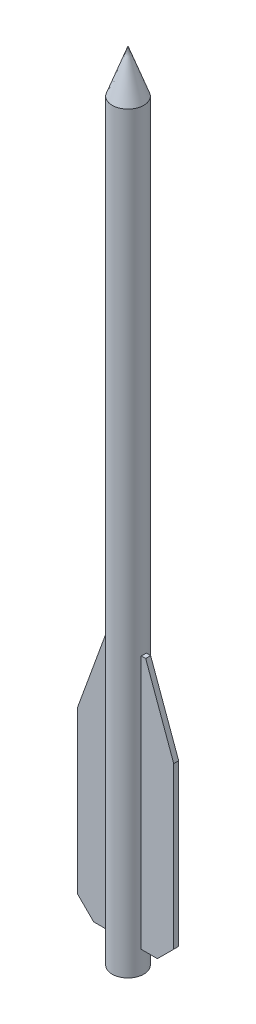
ISO-10303-21;
HEADER;
FILE_DESCRIPTION(('STEP AP214'),'2;1');
FILE_NAME('part.step','',(''),(''),'','','');
FILE_SCHEMA(('AUTOMOTIVE_DESIGN { 1 0 10303 214 1 1 1 1 }'));
ENDSEC;
DATA;
#1=APPLICATION_CONTEXT('core data for automotive mechanical design processes');
#2=APPLICATION_PROTOCOL_DEFINITION('international standard','automotive_design',2000,#1);
#3=PRODUCT_CONTEXT('',#1,'mechanical');
#4=PRODUCT('Part','Part','',(#3));
#5=PRODUCT_RELATED_PRODUCT_CATEGORY('part','',(#4));
#6=PRODUCT_DEFINITION_FORMATION('','',#4);
#7=PRODUCT_DEFINITION_CONTEXT('part definition',#1,'design');
#8=PRODUCT_DEFINITION('design','',#6,#7);
#9=PRODUCT_DEFINITION_SHAPE('','',#8);
#10=(LENGTH_UNIT() NAMED_UNIT(*) SI_UNIT(.MILLI.,.METRE.));
#11=(NAMED_UNIT(*) PLANE_ANGLE_UNIT() SI_UNIT($,.RADIAN.));
#12=(NAMED_UNIT(*) SI_UNIT($,.STERADIAN.) SOLID_ANGLE_UNIT());
#13=UNCERTAINTY_MEASURE_WITH_UNIT(LENGTH_MEASURE(1.E-05),#10,'distance_accuracy_value','');
#14=(GEOMETRIC_REPRESENTATION_CONTEXT(3) GLOBAL_UNCERTAINTY_ASSIGNED_CONTEXT((#13)) GLOBAL_UNIT_ASSIGNED_CONTEXT((#10,
#11,#12)) REPRESENTATION_CONTEXT('',''));
#15=CARTESIAN_POINT('',(0.,0.,0.));
#16=DIRECTION('',(0.,0.,1.));
#17=DIRECTION('',(1.,0.,0.));
#18=AXIS2_PLACEMENT_3D('',#15,#16,#17);
#19=CARTESIAN_POINT('',(0.,161.,0.));
#20=DIRECTION('',(0.,-1.,0.));
#21=DIRECTION('',(0.,0.,-1.));
#22=AXIS2_PLACEMENT_3D('',#19,#20,#21);
#23=CYLINDRICAL_SURFACE('',#22,3.2);
#24=DIRECTION('',(0.,-1.,0.));
#25=VECTOR('',#24,1.);
#26=CARTESIAN_POINT('',(-3.16069612585582,161.,0.5));
#27=LINE('',#26,#25);
#28=CARTESIAN_POINT('',(-3.16069612585582,4.6,0.5));
#29=VERTEX_POINT('',#28);
#30=CARTESIAN_POINT('',(-3.16069612585582,56.,0.5));
#31=VERTEX_POINT('',#30);
#32=EDGE_CURVE('E222',#29,#31,#27,.F.);
#33=ORIENTED_EDGE('',*,*,#32,.F.);
#34=CARTESIAN_POINT('',(0.,4.59999999999999,0.));
#35=DIRECTION('',(0.,1.,0.));
#36=DIRECTION('',(-1.,0.,0.));
#37=AXIS2_PLACEMENT_3D('',#34,#35,#36);
#38=CIRCLE('',#37,3.2);
#39=CARTESIAN_POINT('',(-3.16069612585582,4.6,-0.5));
#40=VERTEX_POINT('',#39);
#41=EDGE_CURVE('E218',#40,#29,#38,.T.);
#42=ORIENTED_EDGE('',*,*,#41,.F.);
#43=DIRECTION('',(0.,-1.,0.));
#44=VECTOR('',#43,1.);
#45=CARTESIAN_POINT('',(-3.16069612585582,161.,-0.5));
#46=LINE('',#45,#44);
#47=CARTESIAN_POINT('',(-3.16069612585582,56.,-0.5));
#48=VERTEX_POINT('',#47);
#49=EDGE_CURVE('E215',#40,#48,#46,.F.);
#50=ORIENTED_EDGE('',*,*,#49,.T.);
#51=CARTESIAN_POINT('',(0.,56.,0.));
#52=DIRECTION('',(0.,-1.,0.));
#53=DIRECTION('',(0.,0.,-1.));
#54=AXIS2_PLACEMENT_3D('',#51,#52,#53);
#55=CIRCLE('',#54,3.2);
#56=EDGE_CURVE('E220',#31,#48,#55,.T.);
#57=ORIENTED_EDGE('',*,*,#56,.F.);
#58=EDGE_LOOP('',(#33,#42,#50,#57));
#59=FACE_BOUND('',#58,.T.);
#60=CARTESIAN_POINT('',(0.,152.208072257745,0.));
#61=DIRECTION('',(0.,1.,0.));
#62=DIRECTION('',(0.,0.,1.));
#63=AXIS2_PLACEMENT_3D('',#60,#61,#62);
#64=CIRCLE('',#63,3.2);
#65=CARTESIAN_POINT('',(0.,152.208072257745,3.2));
#66=VERTEX_POINT('',#65);
#67=EDGE_CURVE('E212',#66,#66,#64,.F.);
#68=ORIENTED_EDGE('',*,*,#67,.T.);
#69=EDGE_LOOP('',(#68));
#70=FACE_BOUND('',#69,.T.);
#71=CARTESIAN_POINT('',(0.,0.,0.));
#72=DIRECTION('',(0.,1.,0.));
#73=DIRECTION('',(0.,0.,1.));
#74=AXIS2_PLACEMENT_3D('',#71,#72,#73);
#75=CIRCLE('',#74,3.2);
#76=CARTESIAN_POINT('',(0.,0.,3.2));
#77=VERTEX_POINT('',#76);
#78=EDGE_CURVE('E209',#77,#77,#75,.T.);
#79=ORIENTED_EDGE('',*,*,#78,.T.);
#80=EDGE_LOOP('',(#79));
#81=FACE_BOUND('',#80,.T.);
#82=DIRECTION('',(0.,-1.,0.));
#83=VECTOR('',#82,1.);
#84=CARTESIAN_POINT('',(3.16069612585582,161.,0.5));
#85=LINE('',#84,#83);
#86=CARTESIAN_POINT('',(3.16069612585582,56.,0.5));
#87=VERTEX_POINT('',#86);
#88=CARTESIAN_POINT('',(3.16069612585582,4.6,0.5));
#89=VERTEX_POINT('',#88);
#90=EDGE_CURVE('E11',#87,#89,#85,.T.);
#91=ORIENTED_EDGE('',*,*,#90,.F.);
#92=CARTESIAN_POINT('',(0.,56.,0.));
#93=DIRECTION('',(0.,1.,0.));
#94=DIRECTION('',(0.,0.,1.));
#95=AXIS2_PLACEMENT_3D('',#92,#93,#94);
#96=CIRCLE('',#95,3.2);
#97=CARTESIAN_POINT('',(3.16069612585582,56.,-0.5));
#98=VERTEX_POINT('',#97);
#99=EDGE_CURVE('E227',#87,#98,#96,.T.);
#100=ORIENTED_EDGE('',*,*,#99,.T.);
#101=DIRECTION('',(0.,-1.,0.));
#102=VECTOR('',#101,1.);
#103=CARTESIAN_POINT('',(3.16069612585582,161.,-0.5));
#104=LINE('',#103,#102);
#105=CARTESIAN_POINT('',(3.16069612585582,4.59999999999999,-0.5));
#106=VERTEX_POINT('',#105);
#107=EDGE_CURVE('E224',#98,#106,#104,.T.);
#108=ORIENTED_EDGE('',*,*,#107,.T.);
#109=CARTESIAN_POINT('',(0.,4.59999999999999,0.));
#110=DIRECTION('',(0.,-1.,0.));
#111=DIRECTION('',(1.,0.,0.));
#112=AXIS2_PLACEMENT_3D('',#109,#110,#111);
#113=CIRCLE('',#112,3.2);
#114=EDGE_CURVE('E47',#106,#89,#113,.T.);
#115=ORIENTED_EDGE('',*,*,#114,.T.);
#116=EDGE_LOOP('',(#91,#100,#108,#115));
#117=FACE_BOUND('',#116,.T.);
#118=ADVANCED_FACE('F38',(#59,#70,#81,#117),#23,.T.);
#119=CARTESIAN_POINT('',(0.,0.,0.));
#120=DIRECTION('',(0.,1.,0.));
#121=DIRECTION('',(0.,0.,1.));
#122=AXIS2_PLACEMENT_3D('',#119,#120,#121);
#123=PLANE('',#122);
#124=ORIENTED_EDGE('',*,*,#78,.F.);
#125=EDGE_LOOP('',(#124));
#126=FACE_BOUND('',#125,.T.);
#127=ADVANCED_FACE('F251',(#126),#123,.F.);
#128=CARTESIAN_POINT('',(0.,152.208072257745,0.));
#129=DIRECTION('',(0.,-1.,0.));
#130=DIRECTION('',(0.,0.,-1.));
#131=AXIS2_PLACEMENT_3D('',#128,#129,#130);
#132=CONICAL_SURFACE('',#131,3.19999999999997,0.349065850398862);
#133=ORIENTED_EDGE('',*,*,#67,.F.);
#134=EDGE_LOOP('',(#133));
#135=FACE_BOUND('',#134,.T.);
#136=CARTESIAN_POINT('',(0.,161.,0.));
#137=VERTEX_POINT('',#136);
#138=VERTEX_LOOP('',#137);
#139=FACE_BOUND('',#138,.T.);
#140=ADVANCED_FACE('F41',(#135,#139),#132,.T.);
#141=CARTESIAN_POINT('',(0.,0.,0.5));
#142=DIRECTION('',(0.,0.,-1.));
#143=DIRECTION('',(-1.,0.,0.));
#144=AXIS2_PLACEMENT_3D('',#141,#142,#143);
#145=PLANE('',#144);
#146=DIRECTION('',(1.,0.,0.));
#147=VECTOR('',#146,1.);
#148=CARTESIAN_POINT('',(0.,4.6,0.5));
#149=LINE('',#148,#147);
#150=CARTESIAN_POINT('',(-6.45,4.6,0.5));
#151=VERTEX_POINT('',#150);
#152=EDGE_CURVE('E185',#151,#29,#149,.T.);
#153=ORIENTED_EDGE('',*,*,#152,.T.);
#154=ORIENTED_EDGE('',*,*,#32,.T.);
#155=DIRECTION('',(-1.,0.,0.));
#156=VECTOR('',#155,1.);
#157=CARTESIAN_POINT('',(-4.08118555115109,56.,0.5));
#158=LINE('',#157,#156);
#159=CARTESIAN_POINT('',(-4.08118555115109,56.,0.5));
#160=VERTEX_POINT('',#159);
#161=EDGE_CURVE('E176',#31,#160,#158,.T.);
#162=ORIENTED_EDGE('',*,*,#161,.T.);
#163=DIRECTION('',(-0.342020143325663,-0.939692620785911,0.));
#164=VECTOR('',#163,1.);
#165=CARTESIAN_POINT('',(-9.75,40.4250603067092,0.5));
#166=LINE('',#165,#164);
#167=CARTESIAN_POINT('',(-9.75,40.4250603067092,0.5));
#168=VERTEX_POINT('',#167);
#169=EDGE_CURVE('E178',#160,#168,#166,.T.);
#170=ORIENTED_EDGE('',*,*,#169,.T.);
#171=DIRECTION('',(0.,-1.,0.));
#172=VECTOR('',#171,1.);
#173=CARTESIAN_POINT('',(-9.75,7.90000000000001,0.5));
#174=LINE('',#173,#172);
#175=CARTESIAN_POINT('',(-9.75,7.90000000000001,0.5));
#176=VERTEX_POINT('',#175);
#177=EDGE_CURVE('E181',#168,#176,#174,.T.);
#178=ORIENTED_EDGE('',*,*,#177,.T.);
#179=DIRECTION('',(0.707106781186546,-0.707106781186549,0.));
#180=VECTOR('',#179,1.);
#181=CARTESIAN_POINT('',(-6.45,4.6,0.5));
#182=LINE('',#181,#180);
#183=EDGE_CURVE('E183',#176,#151,#182,.T.);
#184=ORIENTED_EDGE('',*,*,#183,.T.);
#185=EDGE_LOOP('',(#153,#154,#162,#170,#178,#184));
#186=FACE_BOUND('',#185,.T.);
#187=ADVANCED_FACE('F284',(#186),#145,.F.);
#188=CARTESIAN_POINT('',(0.,0.,-0.5));
#189=DIRECTION('',(0.,0.,-1.));
#190=DIRECTION('',(-1.,0.,0.));
#191=AXIS2_PLACEMENT_3D('',#188,#189,#190);
#192=PLANE('',#191);
#193=ORIENTED_EDGE('',*,*,#49,.F.);
#194=DIRECTION('',(1.,0.,0.));
#195=VECTOR('',#194,1.);
#196=CARTESIAN_POINT('',(0.,4.6,-0.5));
#197=LINE('',#196,#195);
#198=CARTESIAN_POINT('',(-6.45,4.6,-0.5));
#199=VERTEX_POINT('',#198);
#200=EDGE_CURVE('E179',#199,#40,#197,.T.);
#201=ORIENTED_EDGE('',*,*,#200,.F.);
#202=DIRECTION('',(0.707106781186546,-0.707106781186549,0.));
#203=VECTOR('',#202,1.);
#204=CARTESIAN_POINT('',(-6.45,4.6,-0.5));
#205=LINE('',#204,#203);
#206=CARTESIAN_POINT('',(-9.75,7.90000000000001,-0.5));
#207=VERTEX_POINT('',#206);
#208=EDGE_CURVE('E194',#207,#199,#205,.T.);
#209=ORIENTED_EDGE('',*,*,#208,.F.);
#210=DIRECTION('',(0.,-1.,0.));
#211=VECTOR('',#210,1.);
#212=CARTESIAN_POINT('',(-9.75,7.90000000000001,-0.5));
#213=LINE('',#212,#211);
#214=CARTESIAN_POINT('',(-9.75,40.4250603067092,-0.5));
#215=VERTEX_POINT('',#214);
#216=EDGE_CURVE('E192',#215,#207,#213,.T.);
#217=ORIENTED_EDGE('',*,*,#216,.F.);
#218=DIRECTION('',(-0.342020143325663,-0.939692620785911,0.));
#219=VECTOR('',#218,1.);
#220=CARTESIAN_POINT('',(-9.75,40.4250603067092,-0.5));
#221=LINE('',#220,#219);
#222=CARTESIAN_POINT('',(-4.08118555115109,56.,-0.5));
#223=VERTEX_POINT('',#222);
#224=EDGE_CURVE('E190',#223,#215,#221,.T.);
#225=ORIENTED_EDGE('',*,*,#224,.F.);
#226=DIRECTION('',(-1.,0.,0.));
#227=VECTOR('',#226,1.);
#228=CARTESIAN_POINT('',(-4.08118555115109,56.,-0.5));
#229=LINE('',#228,#227);
#230=EDGE_CURVE('E62',#48,#223,#229,.T.);
#231=ORIENTED_EDGE('',*,*,#230,.F.);
#232=EDGE_LOOP('',(#193,#201,#209,#217,#225,#231));
#233=FACE_BOUND('',#232,.T.);
#234=ADVANCED_FACE('F265',(#233),#192,.T.);
#235=CARTESIAN_POINT('',(-4.08118555115109,56.,0.5));
#236=DIRECTION('',(0.,-1.,0.));
#237=DIRECTION('',(0.,0.,-1.));
#238=AXIS2_PLACEMENT_3D('',#235,#236,#237);
#239=PLANE('',#238);
#240=ORIENTED_EDGE('',*,*,#161,.F.);
#241=ORIENTED_EDGE('',*,*,#56,.T.);
#242=ORIENTED_EDGE('',*,*,#230,.T.);
#243=DIRECTION('',(0.,0.,-1.));
#244=VECTOR('',#243,1.);
#245=CARTESIAN_POINT('',(-4.08118555115109,56.,0.5));
#246=LINE('',#245,#244);
#247=EDGE_CURVE('E206',#160,#223,#246,.T.);
#248=ORIENTED_EDGE('',*,*,#247,.F.);
#249=EDGE_LOOP('',(#240,#241,#242,#248));
#250=FACE_BOUND('',#249,.T.);
#251=ADVANCED_FACE('F261',(#250),#239,.F.);
#252=CARTESIAN_POINT('',(-9.75,40.4250603067092,0.5));
#253=DIRECTION('',(0.939692620785911,-0.342020143325663,0.));
#254=DIRECTION('',(0.342020143325663,0.939692620785911,0.));
#255=AXIS2_PLACEMENT_3D('',#252,#253,#254);
#256=PLANE('',#255);
#257=ORIENTED_EDGE('',*,*,#224,.T.);
#258=DIRECTION('',(0.,0.,-1.));
#259=VECTOR('',#258,1.);
#260=CARTESIAN_POINT('',(-9.75,40.4250603067092,0.5));
#261=LINE('',#260,#259);
#262=EDGE_CURVE('E203',#168,#215,#261,.T.);
#263=ORIENTED_EDGE('',*,*,#262,.F.);
#264=ORIENTED_EDGE('',*,*,#169,.F.);
#265=ORIENTED_EDGE('',*,*,#247,.T.);
#266=EDGE_LOOP('',(#257,#263,#264,#265));
#267=FACE_BOUND('',#266,.T.);
#268=ADVANCED_FACE('F264',(#267),#256,.F.);
#269=CARTESIAN_POINT('',(-9.75,7.90000000000001,0.5));
#270=DIRECTION('',(1.,0.,0.));
#271=DIRECTION('',(0.,0.,-1.));
#272=AXIS2_PLACEMENT_3D('',#269,#270,#271);
#273=PLANE('',#272);
#274=ORIENTED_EDGE('',*,*,#216,.T.);
#275=DIRECTION('',(0.,0.,-1.));
#276=VECTOR('',#275,1.);
#277=CARTESIAN_POINT('',(-9.75,7.90000000000001,0.5));
#278=LINE('',#277,#276);
#279=EDGE_CURVE('E200',#176,#207,#278,.T.);
#280=ORIENTED_EDGE('',*,*,#279,.F.);
#281=ORIENTED_EDGE('',*,*,#177,.F.);
#282=ORIENTED_EDGE('',*,*,#262,.T.);
#283=EDGE_LOOP('',(#274,#280,#281,#282));
#284=FACE_BOUND('',#283,.T.);
#285=ADVANCED_FACE('F269',(#284),#273,.F.);
#286=CARTESIAN_POINT('',(-6.45,4.6,0.5));
#287=DIRECTION('',(0.707106781186549,0.707106781186546,0.));
#288=DIRECTION('',(-0.707106781186546,0.707106781186549,0.));
#289=AXIS2_PLACEMENT_3D('',#286,#287,#288);
#290=PLANE('',#289);
#291=ORIENTED_EDGE('',*,*,#208,.T.);
#292=DIRECTION('',(0.,0.,-1.));
#293=VECTOR('',#292,1.);
#294=CARTESIAN_POINT('',(-6.45,4.6,0.5));
#295=LINE('',#294,#293);
#296=EDGE_CURVE('E188',#151,#199,#295,.T.);
#297=ORIENTED_EDGE('',*,*,#296,.F.);
#298=ORIENTED_EDGE('',*,*,#183,.F.);
#299=ORIENTED_EDGE('',*,*,#279,.T.);
#300=EDGE_LOOP('',(#291,#297,#298,#299));
#301=FACE_BOUND('',#300,.T.);
#302=ADVANCED_FACE('F273',(#301),#290,.F.);
#303=CARTESIAN_POINT('',(0.,4.6,0.5));
#304=DIRECTION('',(0.,1.,0.));
#305=DIRECTION('',(-1.,0.,0.));
#306=AXIS2_PLACEMENT_3D('',#303,#304,#305);
#307=PLANE('',#306);
#308=ORIENTED_EDGE('',*,*,#200,.T.);
#309=ORIENTED_EDGE('',*,*,#41,.T.);
#310=ORIENTED_EDGE('',*,*,#152,.F.);
#311=ORIENTED_EDGE('',*,*,#296,.T.);
#312=EDGE_LOOP('',(#308,#309,#310,#311));
#313=FACE_BOUND('',#312,.T.);
#314=ADVANCED_FACE('F277',(#313),#307,.F.);
#315=CARTESIAN_POINT('',(0.,0.,0.5));
#316=DIRECTION('',(0.,0.,-1.));
#317=DIRECTION('',(1.,0.,0.));
#318=AXIS2_PLACEMENT_3D('',#315,#316,#317);
#319=PLANE('',#318);
#320=DIRECTION('',(1.,0.,0.));
#321=VECTOR('',#320,1.);
#322=CARTESIAN_POINT('',(4.08118555115109,56.,0.5));
#323=LINE('',#322,#321);
#324=CARTESIAN_POINT('',(4.08118555115109,56.,0.5));
#325=VERTEX_POINT('',#324);
#326=EDGE_CURVE('E158',#87,#325,#323,.T.);
#327=ORIENTED_EDGE('',*,*,#326,.F.);
#328=ORIENTED_EDGE('',*,*,#90,.T.);
#329=DIRECTION('',(-1.,0.,0.));
#330=VECTOR('',#329,1.);
#331=CARTESIAN_POINT('',(0.,4.6,0.5));
#332=LINE('',#331,#330);
#333=CARTESIAN_POINT('',(6.45,4.6,0.5));
#334=VERTEX_POINT('',#333);
#335=EDGE_CURVE('E133',#334,#89,#332,.T.);
#336=ORIENTED_EDGE('',*,*,#335,.F.);
#337=DIRECTION('',(-0.707106781186546,-0.707106781186549,0.));
#338=VECTOR('',#337,1.);
#339=CARTESIAN_POINT('',(6.45,4.6,0.5));
#340=LINE('',#339,#338);
#341=CARTESIAN_POINT('',(9.75,7.90000000000001,0.5));
#342=VERTEX_POINT('',#341);
#343=EDGE_CURVE('E145',#342,#334,#340,.T.);
#344=ORIENTED_EDGE('',*,*,#343,.F.);
#345=DIRECTION('',(0.,-1.,0.));
#346=VECTOR('',#345,1.);
#347=CARTESIAN_POINT('',(9.75,7.90000000000001,0.5));
#348=LINE('',#347,#346);
#349=CARTESIAN_POINT('',(9.75,40.4250603067092,0.5));
#350=VERTEX_POINT('',#349);
#351=EDGE_CURVE('E151',#350,#342,#348,.T.);
#352=ORIENTED_EDGE('',*,*,#351,.F.);
#353=DIRECTION('',(0.342020143325663,-0.939692620785911,0.));
#354=VECTOR('',#353,1.);
#355=CARTESIAN_POINT('',(9.75,40.4250603067092,0.5));
#356=LINE('',#355,#354);
#357=EDGE_CURVE('E153',#325,#350,#356,.T.);
#358=ORIENTED_EDGE('',*,*,#357,.F.);
#359=EDGE_LOOP('',(#327,#328,#336,#344,#352,#358));
#360=FACE_BOUND('',#359,.T.);
#361=ADVANCED_FACE('F143',(#360),#319,.F.);
#362=CARTESIAN_POINT('',(0.,0.,-0.5));
#363=DIRECTION('',(0.,0.,-1.));
#364=DIRECTION('',(1.,0.,0.));
#365=AXIS2_PLACEMENT_3D('',#362,#363,#364);
#366=PLANE('',#365);
#367=ORIENTED_EDGE('',*,*,#107,.F.);
#368=DIRECTION('',(1.,0.,0.));
#369=VECTOR('',#368,1.);
#370=CARTESIAN_POINT('',(4.08118555115109,56.,-0.5));
#371=LINE('',#370,#369);
#372=CARTESIAN_POINT('',(4.08118555115109,56.,-0.5));
#373=VERTEX_POINT('',#372);
#374=EDGE_CURVE('E148',#98,#373,#371,.T.);
#375=ORIENTED_EDGE('',*,*,#374,.T.);
#376=DIRECTION('',(0.342020143325663,-0.939692620785911,0.));
#377=VECTOR('',#376,1.);
#378=CARTESIAN_POINT('',(9.75,40.4250603067092,-0.5));
#379=LINE('',#378,#377);
#380=CARTESIAN_POINT('',(9.75,40.4250603067092,-0.5));
#381=VERTEX_POINT('',#380);
#382=EDGE_CURVE('E167',#373,#381,#379,.T.);
#383=ORIENTED_EDGE('',*,*,#382,.T.);
#384=DIRECTION('',(0.,-1.,0.));
#385=VECTOR('',#384,1.);
#386=CARTESIAN_POINT('',(9.75,7.90000000000001,-0.5));
#387=LINE('',#386,#385);
#388=CARTESIAN_POINT('',(9.75,7.90000000000001,-0.5));
#389=VERTEX_POINT('',#388);
#390=EDGE_CURVE('E164',#381,#389,#387,.T.);
#391=ORIENTED_EDGE('',*,*,#390,.T.);
#392=DIRECTION('',(-0.707106781186546,-0.707106781186549,0.));
#393=VECTOR('',#392,1.);
#394=CARTESIAN_POINT('',(6.45,4.6,-0.5));
#395=LINE('',#394,#393);
#396=CARTESIAN_POINT('',(6.45,4.6,-0.5));
#397=VERTEX_POINT('',#396);
#398=EDGE_CURVE('E162',#389,#397,#395,.T.);
#399=ORIENTED_EDGE('',*,*,#398,.T.);
#400=DIRECTION('',(-1.,0.,0.));
#401=VECTOR('',#400,1.);
#402=CARTESIAN_POINT('',(0.,4.6,-0.5));
#403=LINE('',#402,#401);
#404=EDGE_CURVE('E54',#397,#106,#403,.T.);
#405=ORIENTED_EDGE('',*,*,#404,.T.);
#406=EDGE_LOOP('',(#367,#375,#383,#391,#399,#405));
#407=FACE_BOUND('',#406,.T.);
#408=ADVANCED_FACE('F231',(#407),#366,.T.);
#409=CARTESIAN_POINT('',(0.,4.6,0.5));
#410=DIRECTION('',(0.,-1.,0.));
#411=DIRECTION('',(1.,0.,0.));
#412=AXIS2_PLACEMENT_3D('',#409,#410,#411);
#413=PLANE('',#412);
#414=ORIENTED_EDGE('',*,*,#114,.F.);
#415=ORIENTED_EDGE('',*,*,#404,.F.);
#416=DIRECTION('',(0.,0.,-1.));
#417=VECTOR('',#416,1.);
#418=CARTESIAN_POINT('',(6.45,4.6,0.5));
#419=LINE('',#418,#417);
#420=EDGE_CURVE('E130',#334,#397,#419,.T.);
#421=ORIENTED_EDGE('',*,*,#420,.F.);
#422=ORIENTED_EDGE('',*,*,#335,.T.);
#423=EDGE_LOOP('',(#414,#415,#421,#422));
#424=FACE_BOUND('',#423,.T.);
#425=ADVANCED_FACE('F132',(#424),#413,.T.);
#426=CARTESIAN_POINT('',(6.45,4.6,0.5));
#427=DIRECTION('',(0.707106781186549,-0.707106781186546,0.));
#428=DIRECTION('',(0.707106781186546,0.707106781186549,0.));
#429=AXIS2_PLACEMENT_3D('',#426,#427,#428);
#430=PLANE('',#429);
#431=ORIENTED_EDGE('',*,*,#398,.F.);
#432=DIRECTION('',(0.,0.,-1.));
#433=VECTOR('',#432,1.);
#434=CARTESIAN_POINT('',(9.75,7.90000000000001,0.5));
#435=LINE('',#434,#433);
#436=EDGE_CURVE('E138',#342,#389,#435,.T.);
#437=ORIENTED_EDGE('',*,*,#436,.F.);
#438=ORIENTED_EDGE('',*,*,#343,.T.);
#439=ORIENTED_EDGE('',*,*,#420,.T.);
#440=EDGE_LOOP('',(#431,#437,#438,#439));
#441=FACE_BOUND('',#440,.T.);
#442=ADVANCED_FACE('F150',(#441),#430,.T.);
#443=CARTESIAN_POINT('',(9.75,7.90000000000001,0.5));
#444=DIRECTION('',(1.,0.,0.));
#445=DIRECTION('',(0.,0.,-1.));
#446=AXIS2_PLACEMENT_3D('',#443,#444,#445);
#447=PLANE('',#446);
#448=ORIENTED_EDGE('',*,*,#390,.F.);
#449=DIRECTION('',(0.,0.,-1.));
#450=VECTOR('',#449,1.);
#451=CARTESIAN_POINT('',(9.75,40.4250603067092,0.5));
#452=LINE('',#451,#450);
#453=EDGE_CURVE('E173',#350,#381,#452,.T.);
#454=ORIENTED_EDGE('',*,*,#453,.F.);
#455=ORIENTED_EDGE('',*,*,#351,.T.);
#456=ORIENTED_EDGE('',*,*,#436,.T.);
#457=EDGE_LOOP('',(#448,#454,#455,#456));
#458=FACE_BOUND('',#457,.T.);
#459=ADVANCED_FACE('F241',(#458),#447,.T.);
#460=CARTESIAN_POINT('',(9.75,40.4250603067092,0.5));
#461=DIRECTION('',(0.939692620785911,0.342020143325663,0.));
#462=DIRECTION('',(-0.342020143325663,0.939692620785911,0.));
#463=AXIS2_PLACEMENT_3D('',#460,#461,#462);
#464=PLANE('',#463);
#465=ORIENTED_EDGE('',*,*,#382,.F.);
#466=DIRECTION('',(0.,0.,-1.));
#467=VECTOR('',#466,1.);
#468=CARTESIAN_POINT('',(4.08118555115109,56.,0.5));
#469=LINE('',#468,#467);
#470=EDGE_CURVE('E160',#325,#373,#469,.T.);
#471=ORIENTED_EDGE('',*,*,#470,.F.);
#472=ORIENTED_EDGE('',*,*,#357,.T.);
#473=ORIENTED_EDGE('',*,*,#453,.T.);
#474=EDGE_LOOP('',(#465,#471,#472,#473));
#475=FACE_BOUND('',#474,.T.);
#476=ADVANCED_FACE('F238',(#475),#464,.T.);
#477=CARTESIAN_POINT('',(4.08118555115109,56.,0.5));
#478=DIRECTION('',(0.,1.,0.));
#479=DIRECTION('',(0.,0.,1.));
#480=AXIS2_PLACEMENT_3D('',#477,#478,#479);
#481=PLANE('',#480);
#482=ORIENTED_EDGE('',*,*,#99,.F.);
#483=ORIENTED_EDGE('',*,*,#326,.T.);
#484=ORIENTED_EDGE('',*,*,#470,.T.);
#485=ORIENTED_EDGE('',*,*,#374,.F.);
#486=EDGE_LOOP('',(#482,#483,#484,#485));
#487=FACE_BOUND('',#486,.T.);
#488=ADVANCED_FACE('F233',(#487),#481,.T.);
#489=CLOSED_SHELL('',(#118,#127,#140,#187,#234,#251,#268,#285,#302,#314,#361,#408,#425,#442,
#459,#476,#488));
#490=MANIFOLD_SOLID_BREP('B2',#489);
#491=ADVANCED_BREP_SHAPE_REPRESENTATION('',(#18,#490),#14);
#492=SHAPE_DEFINITION_REPRESENTATION(#9,#491);
ENDSEC;
END-ISO-10303-21;
